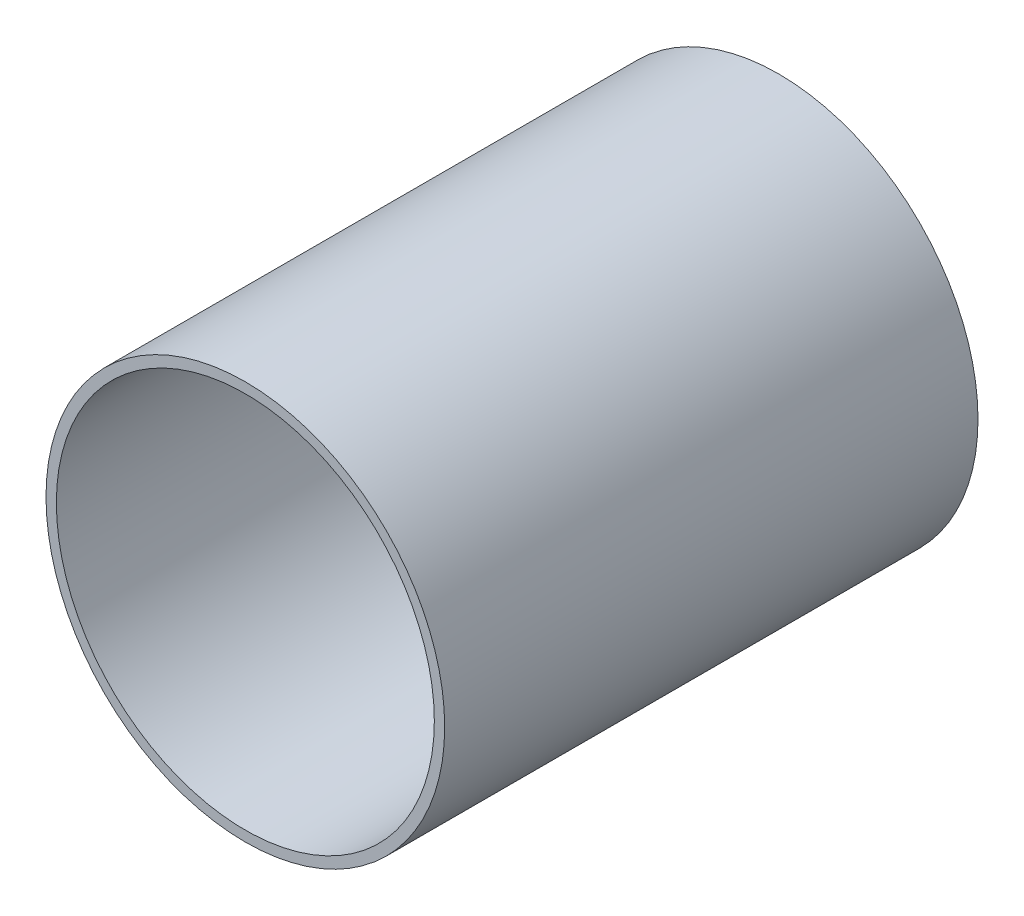
ISO-10303-21;
HEADER;
FILE_DESCRIPTION(('STEP AP214'),'2;1');
FILE_NAME('part.step','',(''),(''),'','','');
FILE_SCHEMA(('AUTOMOTIVE_DESIGN { 1 0 10303 214 1 1 1 1 }'));
ENDSEC;
DATA;
#1=APPLICATION_CONTEXT('core data for automotive mechanical design processes');
#2=APPLICATION_PROTOCOL_DEFINITION('international standard','automotive_design',2000,#1);
#3=PRODUCT_CONTEXT('',#1,'mechanical');
#4=PRODUCT('Part','Part','',(#3));
#5=PRODUCT_RELATED_PRODUCT_CATEGORY('part','',(#4));
#6=PRODUCT_DEFINITION_FORMATION('','',#4);
#7=PRODUCT_DEFINITION_CONTEXT('part definition',#1,'design');
#8=PRODUCT_DEFINITION('design','',#6,#7);
#9=PRODUCT_DEFINITION_SHAPE('','',#8);
#10=(LENGTH_UNIT() NAMED_UNIT(*) SI_UNIT(.MILLI.,.METRE.));
#11=(NAMED_UNIT(*) PLANE_ANGLE_UNIT() SI_UNIT($,.RADIAN.));
#12=(NAMED_UNIT(*) SI_UNIT($,.STERADIAN.) SOLID_ANGLE_UNIT());
#13=UNCERTAINTY_MEASURE_WITH_UNIT(LENGTH_MEASURE(1.E-05),#10,'distance_accuracy_value','');
#14=(GEOMETRIC_REPRESENTATION_CONTEXT(3) GLOBAL_UNCERTAINTY_ASSIGNED_CONTEXT((#13)) GLOBAL_UNIT_ASSIGNED_CONTEXT((#10,
#11,#12)) REPRESENTATION_CONTEXT('',''));
#15=CARTESIAN_POINT('',(0.,0.,0.));
#16=DIRECTION('',(0.,0.,1.));
#17=DIRECTION('',(1.,0.,0.));
#18=AXIS2_PLACEMENT_3D('',#15,#16,#17);
#19=CARTESIAN_POINT('',(0.,0.,10.3));
#20=DIRECTION('',(0.,0.,1.));
#21=DIRECTION('',(1.,0.,0.));
#22=AXIS2_PLACEMENT_3D('',#19,#20,#21);
#23=PLANE('',#22);
#24=CARTESIAN_POINT('',(0.,0.,10.3));
#25=DIRECTION('',(0.,0.,1.));
#26=DIRECTION('',(1.,0.,0.));
#27=AXIS2_PLACEMENT_3D('',#24,#25,#26);
#28=CIRCLE('',#27,3.85);
#29=CARTESIAN_POINT('',(-3.85,0.,10.3));
#30=VERTEX_POINT('',#29);
#31=EDGE_CURVE('E10',#30,#30,#28,.T.);
#32=ORIENTED_EDGE('',*,*,#31,.T.);
#33=EDGE_LOOP('',(#32));
#34=FACE_BOUND('',#33,.T.);
#35=CARTESIAN_POINT('',(0.,0.,10.3));
#36=DIRECTION('',(0.,0.,1.));
#37=DIRECTION('',(1.,0.,0.));
#38=AXIS2_PLACEMENT_3D('',#35,#36,#37);
#39=CIRCLE('',#38,3.65);
#40=CARTESIAN_POINT('',(-3.65,0.,10.3));
#41=VERTEX_POINT('',#40);
#42=EDGE_CURVE('E39',#41,#41,#39,.T.);
#43=ORIENTED_EDGE('',*,*,#42,.F.);
#44=EDGE_LOOP('',(#43));
#45=FACE_BOUND('',#44,.T.);
#46=ADVANCED_FACE('F28',(#34,#45),#23,.T.);
#47=CARTESIAN_POINT('',(0.,0.,0.));
#48=DIRECTION('',(0.,0.,1.));
#49=DIRECTION('',(1.,0.,0.));
#50=AXIS2_PLACEMENT_3D('',#47,#48,#49);
#51=PLANE('',#50);
#52=CARTESIAN_POINT('',(0.,0.,0.));
#53=DIRECTION('',(0.,0.,1.));
#54=DIRECTION('',(1.,0.,0.));
#55=AXIS2_PLACEMENT_3D('',#52,#53,#54);
#56=CIRCLE('',#55,3.85);
#57=CARTESIAN_POINT('',(-3.85,0.,0.));
#58=VERTEX_POINT('',#57);
#59=EDGE_CURVE('E32',#58,#58,#56,.T.);
#60=ORIENTED_EDGE('',*,*,#59,.F.);
#61=EDGE_LOOP('',(#60));
#62=FACE_BOUND('',#61,.T.);
#63=CARTESIAN_POINT('',(0.,0.,0.));
#64=DIRECTION('',(0.,0.,1.));
#65=DIRECTION('',(1.,0.,0.));
#66=AXIS2_PLACEMENT_3D('',#63,#64,#65);
#67=CIRCLE('',#66,3.65);
#68=CARTESIAN_POINT('',(-3.65,0.,0.));
#69=VERTEX_POINT('',#68);
#70=EDGE_CURVE('E41',#69,#69,#67,.T.);
#71=ORIENTED_EDGE('',*,*,#70,.T.);
#72=EDGE_LOOP('',(#71));
#73=FACE_BOUND('',#72,.T.);
#74=ADVANCED_FACE('F51',(#62,#73),#51,.F.);
#75=CARTESIAN_POINT('',(0.,0.,10.3));
#76=DIRECTION('',(0.,0.,-1.));
#77=DIRECTION('',(-1.,0.,0.));
#78=AXIS2_PLACEMENT_3D('',#75,#76,#77);
#79=CYLINDRICAL_SURFACE('',#78,3.85);
#80=CARTESIAN_POINT('',(-3.85,0.,10.3));
#81=CARTESIAN_POINT('',(-3.85,0.,10.1927083333333));
#82=CARTESIAN_POINT('',(-3.85,0.,10.0854166666667));
#83=CARTESIAN_POINT('',(-3.85,0.,9.87083333333333));
#84=CARTESIAN_POINT('',(-3.85,0.,9.76354166666667));
#85=CARTESIAN_POINT('',(-3.85,0.,9.54895833333333));
#86=CARTESIAN_POINT('',(-3.85,0.,9.44166666666667));
#87=CARTESIAN_POINT('',(-3.85,0.,9.22708333333333));
#88=CARTESIAN_POINT('',(-3.85,0.,9.11979166666667));
#89=CARTESIAN_POINT('',(-3.85,0.,8.90520833333333));
#90=CARTESIAN_POINT('',(-3.85,0.,8.79791666666667));
#91=CARTESIAN_POINT('',(-3.85,0.,8.58333333333333));
#92=CARTESIAN_POINT('',(-3.85,0.,8.47604166666667));
#93=CARTESIAN_POINT('',(-3.85,0.,8.26145833333333));
#94=CARTESIAN_POINT('',(-3.85,0.,8.15416666666667));
#95=CARTESIAN_POINT('',(-3.85,0.,7.93958333333333));
#96=CARTESIAN_POINT('',(-3.85,0.,7.83229166666667));
#97=CARTESIAN_POINT('',(-3.85,0.,7.61770833333333));
#98=CARTESIAN_POINT('',(-3.85,0.,7.51041666666667));
#99=CARTESIAN_POINT('',(-3.85,0.,7.29583333333333));
#100=CARTESIAN_POINT('',(-3.85,0.,7.18854166666666));
#101=CARTESIAN_POINT('',(-3.85,0.,6.97395833333333));
#102=CARTESIAN_POINT('',(-3.85,0.,6.86666666666667));
#103=CARTESIAN_POINT('',(-3.85,0.,6.65208333333333));
#104=CARTESIAN_POINT('',(-3.85,0.,6.54479166666667));
#105=CARTESIAN_POINT('',(-3.85,0.,6.33020833333333));
#106=CARTESIAN_POINT('',(-3.85,0.,6.22291666666667));
#107=CARTESIAN_POINT('',(-3.85,0.,6.00833333333333));
#108=CARTESIAN_POINT('',(-3.85,0.,5.90104166666667));
#109=CARTESIAN_POINT('',(-3.85,0.,5.68645833333333));
#110=CARTESIAN_POINT('',(-3.85,0.,5.57916666666667));
#111=CARTESIAN_POINT('',(-3.85,0.,5.36458333333333));
#112=CARTESIAN_POINT('',(-3.85,0.,5.25729166666667));
#113=CARTESIAN_POINT('',(-3.85,0.,5.04270833333333));
#114=CARTESIAN_POINT('',(-3.85,0.,4.93541666666667));
#115=CARTESIAN_POINT('',(-3.85,0.,4.72083333333333));
#116=CARTESIAN_POINT('',(-3.85,0.,4.61354166666666));
#117=CARTESIAN_POINT('',(-3.85,0.,4.39895833333333));
#118=CARTESIAN_POINT('',(-3.85,0.,4.29166666666667));
#119=CARTESIAN_POINT('',(-3.85,0.,4.07708333333333));
#120=CARTESIAN_POINT('',(-3.85,0.,3.96979166666666));
#121=CARTESIAN_POINT('',(-3.85,0.,3.75520833333333));
#122=CARTESIAN_POINT('',(-3.85,0.,3.64791666666666));
#123=CARTESIAN_POINT('',(-3.85,0.,3.43333333333333));
#124=CARTESIAN_POINT('',(-3.85,0.,3.32604166666666));
#125=CARTESIAN_POINT('',(-3.85,0.,3.11145833333333));
#126=CARTESIAN_POINT('',(-3.85,0.,3.00416666666666));
#127=CARTESIAN_POINT('',(-3.85,0.,2.78958333333333));
#128=CARTESIAN_POINT('',(-3.85,0.,2.68229166666666));
#129=CARTESIAN_POINT('',(-3.85,0.,2.46770833333333));
#130=CARTESIAN_POINT('',(-3.85,0.,2.36041666666667));
#131=CARTESIAN_POINT('',(-3.85,0.,2.14583333333333));
#132=CARTESIAN_POINT('',(-3.85,0.,2.03854166666667));
#133=CARTESIAN_POINT('',(-3.85,0.,1.82395833333333));
#134=CARTESIAN_POINT('',(-3.85,0.,1.71666666666667));
#135=CARTESIAN_POINT('',(-3.85,0.,1.50208333333333));
#136=CARTESIAN_POINT('',(-3.85,0.,1.39479166666667));
#137=CARTESIAN_POINT('',(-3.85,0.,1.18020833333333));
#138=CARTESIAN_POINT('',(-3.85,0.,1.07291666666667));
#139=CARTESIAN_POINT('',(-3.85,0.,0.858333333333333));
#140=CARTESIAN_POINT('',(-3.85,0.,0.751041666666665));
#141=CARTESIAN_POINT('',(-3.85,0.,0.536458333333331));
#142=CARTESIAN_POINT('',(-3.85,0.,0.429166666666664));
#143=CARTESIAN_POINT('',(-3.85,0.,0.214583333333331));
#144=CARTESIAN_POINT('',(-3.85,0.,0.107291666666665));
#145=CARTESIAN_POINT('',(-3.85,0.,0.));
#146=B_SPLINE_CURVE_WITH_KNOTS('',3,(#80,#81,#82,#83,#84,#85,#86,#87,#88,#89,#90,#91,#92,#93,
#94,#95,#96,#97,#98,#99,#100,#101,#102,#103,#104,#105,#106,#107,#108,#109,#110,#111,#112,#113,
#114,#115,#116,#117,#118,#119,#120,#121,#122,#123,#124,#125,#126,#127,#128,#129,#130,#131,#132,
#133,#134,#135,#136,#137,#138,#139,#140,#141,#142,#143,#144,#145),.UNSPECIFIED.,.F.,.F.,(4,2,2,
2,2,2,2,2,2,2,2,2,2,2,2,2,2,2,2,2,2,2,2,2,2,2,2,2,2,2,2,2,4),(0.,0.321875000000001,0.64375,
0.965625000000001,1.2875,1.609375,1.93125,2.253125,2.575,2.896875,3.21875,3.540625,3.8625,
4.184375,4.50625,4.828125,5.15,5.471875,5.79375,6.115625,6.4375,6.759375,7.08125,7.403125,7.725,
8.046875,8.36875,8.690625,9.0125,9.334375,9.65625,9.978125,10.3),.UNSPECIFIED.);
#147=EDGE_CURVE('BSEAM30',#30,#58,#146,.T.);
#148=ORIENTED_EDGE('',*,*,#31,.F.);
#149=ORIENTED_EDGE('',*,*,#59,.T.);
#150=ORIENTED_EDGE('',*,*,#147,.T.);
#151=ORIENTED_EDGE('',*,*,#147,.F.);
#152=EDGE_LOOP('',(#148,#150,#149,#151));
#153=FACE_BOUND('',#152,.T.);
#154=ADVANCED_FACE('F30',(#153),#79,.T.);
#155=CARTESIAN_POINT('',(0.,0.,10.3));
#156=DIRECTION('',(0.,0.,-1.));
#157=DIRECTION('',(-1.,0.,0.));
#158=AXIS2_PLACEMENT_3D('',#155,#156,#157);
#159=CYLINDRICAL_SURFACE('',#158,3.65);
#160=CARTESIAN_POINT('',(-3.65,0.,10.3));
#161=CARTESIAN_POINT('',(-3.65,0.,10.1927083333333));
#162=CARTESIAN_POINT('',(-3.65,0.,10.0854166666667));
#163=CARTESIAN_POINT('',(-3.65,0.,9.87083333333333));
#164=CARTESIAN_POINT('',(-3.65,0.,9.76354166666667));
#165=CARTESIAN_POINT('',(-3.65,0.,9.54895833333333));
#166=CARTESIAN_POINT('',(-3.65,0.,9.44166666666667));
#167=CARTESIAN_POINT('',(-3.65,0.,9.22708333333333));
#168=CARTESIAN_POINT('',(-3.65,0.,9.11979166666667));
#169=CARTESIAN_POINT('',(-3.65,0.,8.90520833333333));
#170=CARTESIAN_POINT('',(-3.65,0.,8.79791666666667));
#171=CARTESIAN_POINT('',(-3.65,0.,8.58333333333333));
#172=CARTESIAN_POINT('',(-3.65,0.,8.47604166666667));
#173=CARTESIAN_POINT('',(-3.65,0.,8.26145833333333));
#174=CARTESIAN_POINT('',(-3.65,0.,8.15416666666667));
#175=CARTESIAN_POINT('',(-3.65,0.,7.93958333333333));
#176=CARTESIAN_POINT('',(-3.65,0.,7.83229166666667));
#177=CARTESIAN_POINT('',(-3.65,0.,7.61770833333333));
#178=CARTESIAN_POINT('',(-3.65,0.,7.51041666666667));
#179=CARTESIAN_POINT('',(-3.65,0.,7.29583333333333));
#180=CARTESIAN_POINT('',(-3.65,0.,7.18854166666667));
#181=CARTESIAN_POINT('',(-3.65,0.,6.97395833333333));
#182=CARTESIAN_POINT('',(-3.65,0.,6.86666666666667));
#183=CARTESIAN_POINT('',(-3.65,0.,6.65208333333333));
#184=CARTESIAN_POINT('',(-3.65,0.,6.54479166666667));
#185=CARTESIAN_POINT('',(-3.65,0.,6.33020833333333));
#186=CARTESIAN_POINT('',(-3.65,0.,6.22291666666667));
#187=CARTESIAN_POINT('',(-3.65,0.,6.00833333333333));
#188=CARTESIAN_POINT('',(-3.65,0.,5.90104166666667));
#189=CARTESIAN_POINT('',(-3.65,0.,5.68645833333333));
#190=CARTESIAN_POINT('',(-3.65,0.,5.57916666666667));
#191=CARTESIAN_POINT('',(-3.65,0.,5.36458333333333));
#192=CARTESIAN_POINT('',(-3.65,0.,5.25729166666667));
#193=CARTESIAN_POINT('',(-3.65,0.,5.04270833333333));
#194=CARTESIAN_POINT('',(-3.65,0.,4.93541666666667));
#195=CARTESIAN_POINT('',(-3.65,0.,4.72083333333333));
#196=CARTESIAN_POINT('',(-3.65,0.,4.61354166666667));
#197=CARTESIAN_POINT('',(-3.65,0.,4.39895833333333));
#198=CARTESIAN_POINT('',(-3.65,0.,4.29166666666667));
#199=CARTESIAN_POINT('',(-3.65,0.,4.07708333333333));
#200=CARTESIAN_POINT('',(-3.65,0.,3.96979166666667));
#201=CARTESIAN_POINT('',(-3.65,0.,3.75520833333333));
#202=CARTESIAN_POINT('',(-3.65,0.,3.64791666666667));
#203=CARTESIAN_POINT('',(-3.65,0.,3.43333333333333));
#204=CARTESIAN_POINT('',(-3.65,0.,3.32604166666667));
#205=CARTESIAN_POINT('',(-3.65,0.,3.11145833333333));
#206=CARTESIAN_POINT('',(-3.65,0.,3.00416666666667));
#207=CARTESIAN_POINT('',(-3.65,0.,2.78958333333333));
#208=CARTESIAN_POINT('',(-3.65,0.,2.68229166666667));
#209=CARTESIAN_POINT('',(-3.65,0.,2.46770833333333));
#210=CARTESIAN_POINT('',(-3.65,0.,2.36041666666667));
#211=CARTESIAN_POINT('',(-3.65,0.,2.14583333333333));
#212=CARTESIAN_POINT('',(-3.65,0.,2.03854166666667));
#213=CARTESIAN_POINT('',(-3.65,0.,1.82395833333333));
#214=CARTESIAN_POINT('',(-3.65,0.,1.71666666666667));
#215=CARTESIAN_POINT('',(-3.65,0.,1.50208333333333));
#216=CARTESIAN_POINT('',(-3.65,0.,1.39479166666667));
#217=CARTESIAN_POINT('',(-3.65,0.,1.18020833333333));
#218=CARTESIAN_POINT('',(-3.65,0.,1.07291666666666));
#219=CARTESIAN_POINT('',(-3.65,0.,0.858333333333331));
#220=CARTESIAN_POINT('',(-3.65,0.,0.751041666666665));
#221=CARTESIAN_POINT('',(-3.65,0.,0.536458333333331));
#222=CARTESIAN_POINT('',(-3.65,0.,0.429166666666664));
#223=CARTESIAN_POINT('',(-3.65,0.,0.214583333333331));
#224=CARTESIAN_POINT('',(-3.65,0.,0.107291666666665));
#225=CARTESIAN_POINT('',(-3.65,0.,0.));
#226=B_SPLINE_CURVE_WITH_KNOTS('',3,(#160,#161,#162,#163,#164,#165,#166,#167,#168,#169,#170,
#171,#172,#173,#174,#175,#176,#177,#178,#179,#180,#181,#182,#183,#184,#185,#186,#187,#188,#189,
#190,#191,#192,#193,#194,#195,#196,#197,#198,#199,#200,#201,#202,#203,#204,#205,#206,#207,#208,
#209,#210,#211,#212,#213,#214,#215,#216,#217,#218,#219,#220,#221,#222,#223,#224,#225),
.UNSPECIFIED.,.F.,.F.,(4,2,2,2,2,2,2,2,2,2,2,2,2,2,2,2,2,2,2,2,2,2,2,2,2,2,2,2,2,2,2,2,4),(0.,
0.321874999999999,0.643749999999998,0.965625,1.2875,1.609375,1.93125,2.253125,2.575,2.896875,
3.21875,3.540625,3.8625,4.184375,4.50625,4.828125,5.15,5.471875,5.79375,6.115625,6.4375,
6.759375,7.08125,7.403125,7.725,8.046875,8.36875,8.690625,9.0125,9.334375,9.65625,9.978125,
10.3),.UNSPECIFIED.);
#227=EDGE_CURVE('BSEAM47',#41,#69,#226,.T.);
#228=ORIENTED_EDGE('',*,*,#42,.T.);
#229=ORIENTED_EDGE('',*,*,#70,.F.);
#230=ORIENTED_EDGE('',*,*,#227,.T.);
#231=ORIENTED_EDGE('',*,*,#227,.F.);
#232=EDGE_LOOP('',(#228,#230,#229,#231));
#233=FACE_BOUND('',#232,.T.);
#234=ADVANCED_FACE('F47',(#233),#159,.F.);
#235=CLOSED_SHELL('',(#46,#74,#154,#234));
#236=MANIFOLD_SOLID_BREP('B2',#235);
#237=ADVANCED_BREP_SHAPE_REPRESENTATION('',(#18,#236),#14);
#238=SHAPE_DEFINITION_REPRESENTATION(#9,#237);
ENDSEC;
END-ISO-10303-21;
